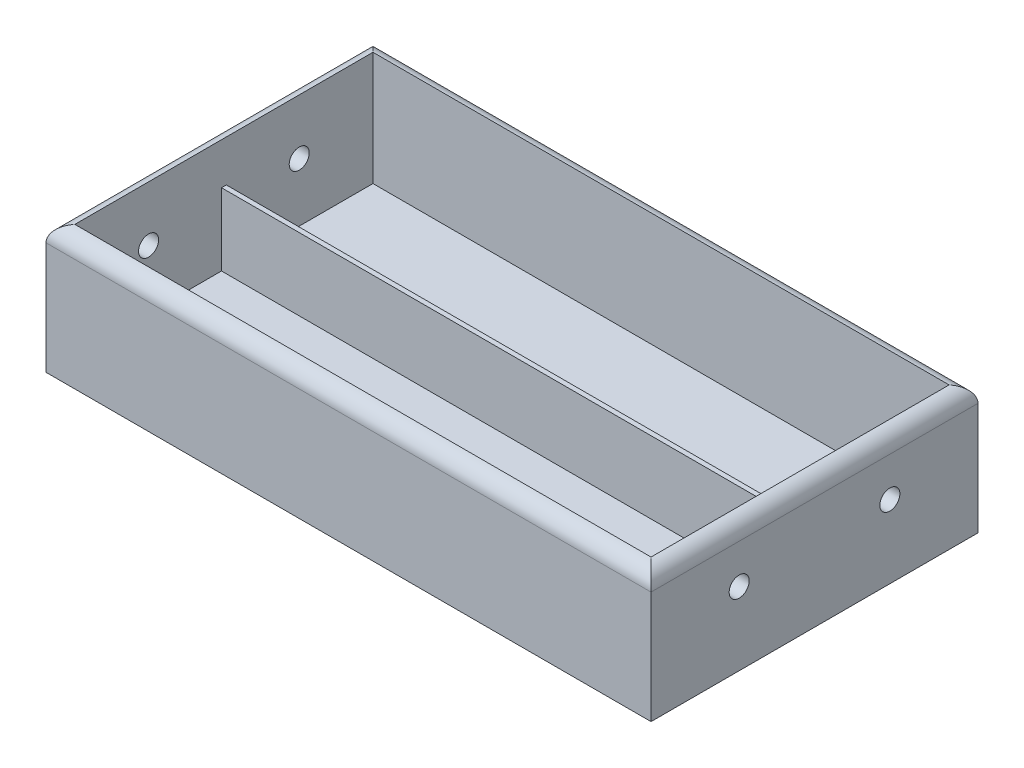
ISO-10303-21;
HEADER;
FILE_DESCRIPTION(('STEP AP214'),'2;1');
FILE_NAME('part.step','',(''),(''),'','','');
FILE_SCHEMA(('AUTOMOTIVE_DESIGN { 1 0 10303 214 1 1 1 1 }'));
ENDSEC;
DATA;
#1=APPLICATION_CONTEXT('core data for automotive mechanical design processes');
#2=APPLICATION_PROTOCOL_DEFINITION('international standard','automotive_design',2000,#1);
#3=PRODUCT_CONTEXT('',#1,'mechanical');
#4=PRODUCT('Part','Part','',(#3));
#5=PRODUCT_RELATED_PRODUCT_CATEGORY('part','',(#4));
#6=PRODUCT_DEFINITION_FORMATION('','',#4);
#7=PRODUCT_DEFINITION_CONTEXT('part definition',#1,'design');
#8=PRODUCT_DEFINITION('design','',#6,#7);
#9=PRODUCT_DEFINITION_SHAPE('','',#8);
#10=(LENGTH_UNIT() NAMED_UNIT(*) SI_UNIT(.MILLI.,.METRE.));
#11=(NAMED_UNIT(*) PLANE_ANGLE_UNIT() SI_UNIT($,.RADIAN.));
#12=(NAMED_UNIT(*) SI_UNIT($,.STERADIAN.) SOLID_ANGLE_UNIT());
#13=UNCERTAINTY_MEASURE_WITH_UNIT(LENGTH_MEASURE(1.E-05),#10,'distance_accuracy_value','');
#14=(GEOMETRIC_REPRESENTATION_CONTEXT(3) GLOBAL_UNCERTAINTY_ASSIGNED_CONTEXT((#13)) GLOBAL_UNIT_ASSIGNED_CONTEXT((#10,
#11,#12)) REPRESENTATION_CONTEXT('',''));
#15=CARTESIAN_POINT('',(0.,0.,0.));
#16=DIRECTION('',(0.,0.,1.));
#17=DIRECTION('',(1.,0.,0.));
#18=AXIS2_PLACEMENT_3D('',#15,#16,#17);
#19=CARTESIAN_POINT('',(0.,1.8,0.));
#20=DIRECTION('',(0.,1.,0.));
#21=DIRECTION('',(0.,0.,1.));
#22=AXIS2_PLACEMENT_3D('',#19,#20,#21);
#23=PLANE('',#22);
#24=DIRECTION('',(0.,0.,-1.));
#25=VECTOR('',#24,1.);
#26=CARTESIAN_POINT('',(35.95,1.8,-20.4));
#27=LINE('',#26,#25);
#28=CARTESIAN_POINT('',(35.95,1.8,18.6));
#29=VERTEX_POINT('',#28);
#30=CARTESIAN_POINT('',(35.95,1.8,0.3));
#31=VERTEX_POINT('',#30);
#32=EDGE_CURVE('E176',#29,#31,#27,.T.);
#33=ORIENTED_EDGE('',*,*,#32,.T.);
#34=DIRECTION('',(1.,0.,0.));
#35=VECTOR('',#34,1.);
#36=CARTESIAN_POINT('',(35.95,1.8,0.3));
#37=LINE('',#36,#35);
#38=CARTESIAN_POINT('',(-35.95,1.8,0.300000000000002));
#39=VERTEX_POINT('',#38);
#40=EDGE_CURVE('E154',#39,#31,#37,.T.);
#41=ORIENTED_EDGE('',*,*,#40,.F.);
#42=DIRECTION('',(0.,0.,1.));
#43=VECTOR('',#42,1.);
#44=CARTESIAN_POINT('',(-35.95,1.8,-20.4));
#45=LINE('',#44,#43);
#46=CARTESIAN_POINT('',(-35.95,1.8,18.6));
#47=VERTEX_POINT('',#46);
#48=EDGE_CURVE('E193',#39,#47,#45,.T.);
#49=ORIENTED_EDGE('',*,*,#48,.T.);
#50=DIRECTION('',(1.,0.,0.));
#51=VECTOR('',#50,1.);
#52=CARTESIAN_POINT('',(-37.75,1.8,18.6));
#53=LINE('',#52,#51);
#54=EDGE_CURVE('E189',#47,#29,#53,.T.);
#55=ORIENTED_EDGE('',*,*,#54,.T.);
#56=EDGE_LOOP('',(#33,#41,#49,#55));
#57=FACE_BOUND('',#56,.T.);
#58=ADVANCED_FACE('F45',(#57),#23,.T.);
#59=CARTESIAN_POINT('',(37.75,16.,-20.4));
#60=DIRECTION('',(-1.,0.,0.));
#61=DIRECTION('',(0.,0.,1.));
#62=AXIS2_PLACEMENT_3D('',#59,#60,#61);
#63=PLANE('',#62);
#64=CARTESIAN_POINT('',(37.75,9.1,-9.40000000000001));
#65=DIRECTION('',(-1.,0.,0.));
#66=DIRECTION('',(0.,0.,1.));
#67=AXIS2_PLACEMENT_3D('',#64,#65,#66);
#68=CIRCLE('',#67,1.25);
#69=CARTESIAN_POINT('',(37.75,9.1,-8.15000000000001));
#70=VERTEX_POINT('',#69);
#71=EDGE_CURVE('E243',#70,#70,#68,.F.);
#72=ORIENTED_EDGE('',*,*,#71,.F.);
#73=EDGE_LOOP('',(#72));
#74=FACE_BOUND('',#73,.T.);
#75=CARTESIAN_POINT('',(37.75,9.1,9.39999999999999));
#76=DIRECTION('',(-1.,0.,0.));
#77=DIRECTION('',(0.,0.,1.));
#78=AXIS2_PLACEMENT_3D('',#75,#76,#77);
#79=CIRCLE('',#78,1.25);
#80=CARTESIAN_POINT('',(37.75,9.1,10.65));
#81=VERTEX_POINT('',#80);
#82=EDGE_CURVE('E237',#81,#81,#79,.F.);
#83=ORIENTED_EDGE('',*,*,#82,.F.);
#84=EDGE_LOOP('',(#83));
#85=FACE_BOUND('',#84,.T.);
#86=DIRECTION('',(0.,-1.,0.));
#87=VECTOR('',#86,1.);
#88=CARTESIAN_POINT('',(37.75,16.,-20.4));
#89=LINE('',#88,#87);
#90=CARTESIAN_POINT('',(37.75,14.,-20.4));
#91=VERTEX_POINT('',#90);
#92=CARTESIAN_POINT('',(37.75,0.,-20.4));
#93=VERTEX_POINT('',#92);
#94=EDGE_CURVE('E229',#91,#93,#89,.T.);
#95=ORIENTED_EDGE('',*,*,#94,.F.);
#96=DIRECTION('',(0.,0.,-1.));
#97=VECTOR('',#96,1.);
#98=CARTESIAN_POINT('',(37.75,14.,20.4));
#99=LINE('',#98,#97);
#100=CARTESIAN_POINT('',(37.75,14.,20.4));
#101=VERTEX_POINT('',#100);
#102=EDGE_CURVE('E11',#91,#101,#99,.F.);
#103=ORIENTED_EDGE('',*,*,#102,.T.);
#104=DIRECTION('',(0.,-1.,0.));
#105=VECTOR('',#104,1.);
#106=CARTESIAN_POINT('',(37.75,16.,20.4));
#107=LINE('',#106,#105);
#108=CARTESIAN_POINT('',(37.75,0.,20.4));
#109=VERTEX_POINT('',#108);
#110=EDGE_CURVE('E220',#101,#109,#107,.T.);
#111=ORIENTED_EDGE('',*,*,#110,.T.);
#112=DIRECTION('',(0.,0.,-1.));
#113=VECTOR('',#112,1.);
#114=CARTESIAN_POINT('',(37.75,0.,-20.4));
#115=LINE('',#114,#113);
#116=EDGE_CURVE('E183',#109,#93,#115,.T.);
#117=ORIENTED_EDGE('',*,*,#116,.T.);
#118=EDGE_LOOP('',(#95,#103,#111,#117));
#119=FACE_BOUND('',#118,.T.);
#120=ADVANCED_FACE('F341',(#74,#85,#119),#63,.F.);
#121=CARTESIAN_POINT('',(-37.75,16.,-20.4));
#122=DIRECTION('',(0.,0.,1.));
#123=DIRECTION('',(1.,0.,0.));
#124=AXIS2_PLACEMENT_3D('',#121,#122,#123);
#125=PLANE('',#124);
#126=DIRECTION('',(0.,-1.,0.));
#127=VECTOR('',#126,1.);
#128=CARTESIAN_POINT('',(-37.75,16.,-20.4));
#129=LINE('',#128,#127);
#130=CARTESIAN_POINT('',(-37.75,14.,-20.4));
#131=VERTEX_POINT('',#130);
#132=CARTESIAN_POINT('',(-37.75,0.,-20.4));
#133=VERTEX_POINT('',#132);
#134=EDGE_CURVE('E226',#131,#133,#129,.T.);
#135=ORIENTED_EDGE('',*,*,#134,.F.);
#136=DIRECTION('',(-1.,0.,0.));
#137=VECTOR('',#136,1.);
#138=CARTESIAN_POINT('',(37.75,14.,-20.4));
#139=LINE('',#138,#137);
#140=EDGE_CURVE('E247',#131,#91,#139,.F.);
#141=ORIENTED_EDGE('',*,*,#140,.T.);
#142=ORIENTED_EDGE('',*,*,#94,.T.);
#143=DIRECTION('',(-1.,0.,0.));
#144=VECTOR('',#143,1.);
#145=CARTESIAN_POINT('',(-37.75,0.,-20.4));
#146=LINE('',#145,#144);
#147=EDGE_CURVE('E208',#93,#133,#146,.T.);
#148=ORIENTED_EDGE('',*,*,#147,.T.);
#149=EDGE_LOOP('',(#135,#141,#142,#148));
#150=FACE_BOUND('',#149,.T.);
#151=ADVANCED_FACE('F346',(#150),#125,.F.);
#152=CARTESIAN_POINT('',(-37.75,16.,-20.4));
#153=DIRECTION('',(1.,0.,0.));
#154=DIRECTION('',(0.,0.,-1.));
#155=AXIS2_PLACEMENT_3D('',#152,#153,#154);
#156=PLANE('',#155);
#157=CARTESIAN_POINT('',(-37.75,9.1,-9.39999999999999));
#158=DIRECTION('',(-1.,0.,0.));
#159=DIRECTION('',(0.,0.,1.));
#160=AXIS2_PLACEMENT_3D('',#157,#158,#159);
#161=CIRCLE('',#160,1.25);
#162=CARTESIAN_POINT('',(-37.75,9.1,-8.14999999999999));
#163=VERTEX_POINT('',#162);
#164=EDGE_CURVE('E278',#163,#163,#161,.T.);
#165=ORIENTED_EDGE('',*,*,#164,.F.);
#166=EDGE_LOOP('',(#165));
#167=FACE_BOUND('',#166,.T.);
#168=CARTESIAN_POINT('',(-37.75,9.1,9.40000000000001));
#169=DIRECTION('',(-1.,0.,0.));
#170=DIRECTION('',(0.,0.,1.));
#171=AXIS2_PLACEMENT_3D('',#168,#169,#170);
#172=CIRCLE('',#171,1.25);
#173=CARTESIAN_POINT('',(-37.75,9.1,10.65));
#174=VERTEX_POINT('',#173);
#175=EDGE_CURVE('E294',#174,#174,#172,.T.);
#176=ORIENTED_EDGE('',*,*,#175,.F.);
#177=EDGE_LOOP('',(#176));
#178=FACE_BOUND('',#177,.T.);
#179=DIRECTION('',(0.,-1.,0.));
#180=VECTOR('',#179,1.);
#181=CARTESIAN_POINT('',(-37.75,16.,20.4));
#182=LINE('',#181,#180);
#183=CARTESIAN_POINT('',(-37.75,14.,20.4));
#184=VERTEX_POINT('',#183);
#185=CARTESIAN_POINT('',(-37.75,0.,20.4));
#186=VERTEX_POINT('',#185);
#187=EDGE_CURVE('E223',#184,#186,#182,.T.);
#188=ORIENTED_EDGE('',*,*,#187,.F.);
#189=DIRECTION('',(0.,0.,1.));
#190=VECTOR('',#189,1.);
#191=CARTESIAN_POINT('',(-37.75,14.,-20.4));
#192=LINE('',#191,#190);
#193=EDGE_CURVE('E254',#184,#131,#192,.F.);
#194=ORIENTED_EDGE('',*,*,#193,.T.);
#195=ORIENTED_EDGE('',*,*,#134,.T.);
#196=DIRECTION('',(0.,0.,1.));
#197=VECTOR('',#196,1.);
#198=CARTESIAN_POINT('',(-37.75,0.,-20.4));
#199=LINE('',#198,#197);
#200=EDGE_CURVE('E212',#133,#186,#199,.T.);
#201=ORIENTED_EDGE('',*,*,#200,.T.);
#202=EDGE_LOOP('',(#188,#194,#195,#201));
#203=FACE_BOUND('',#202,.T.);
#204=ADVANCED_FACE('F395',(#167,#178,#203),#156,.F.);
#205=CARTESIAN_POINT('',(-37.75,16.,20.4));
#206=DIRECTION('',(0.,0.,-1.));
#207=DIRECTION('',(-1.,0.,0.));
#208=AXIS2_PLACEMENT_3D('',#205,#206,#207);
#209=PLANE('',#208);
#210=ORIENTED_EDGE('',*,*,#110,.F.);
#211=DIRECTION('',(1.,0.,0.));
#212=VECTOR('',#211,1.);
#213=CARTESIAN_POINT('',(-37.75,14.,20.4));
#214=LINE('',#213,#212);
#215=EDGE_CURVE('E259',#101,#184,#214,.F.);
#216=ORIENTED_EDGE('',*,*,#215,.T.);
#217=ORIENTED_EDGE('',*,*,#187,.T.);
#218=DIRECTION('',(1.,0.,0.));
#219=VECTOR('',#218,1.);
#220=CARTESIAN_POINT('',(-37.75,0.,20.4));
#221=LINE('',#220,#219);
#222=EDGE_CURVE('E216',#186,#109,#221,.T.);
#223=ORIENTED_EDGE('',*,*,#222,.T.);
#224=EDGE_LOOP('',(#210,#216,#217,#223));
#225=FACE_BOUND('',#224,.T.);
#226=ADVANCED_FACE('F398',(#225),#209,.F.);
#227=CARTESIAN_POINT('',(0.,0.,0.));
#228=DIRECTION('',(0.,1.,0.));
#229=DIRECTION('',(0.,0.,1.));
#230=AXIS2_PLACEMENT_3D('',#227,#228,#229);
#231=PLANE('',#230);
#232=ORIENTED_EDGE('',*,*,#116,.F.);
#233=ORIENTED_EDGE('',*,*,#222,.F.);
#234=ORIENTED_EDGE('',*,*,#200,.F.);
#235=ORIENTED_EDGE('',*,*,#147,.F.);
#236=EDGE_LOOP('',(#232,#233,#234,#235));
#237=FACE_BOUND('',#236,.T.);
#238=ADVANCED_FACE('F367',(#237),#231,.F.);
#239=CARTESIAN_POINT('',(35.95,16.,-20.4));
#240=DIRECTION('',(-1.,0.,0.));
#241=DIRECTION('',(0.,0.,1.));
#242=AXIS2_PLACEMENT_3D('',#239,#240,#241);
#243=PLANE('',#242);
#244=CARTESIAN_POINT('',(35.95,9.1,-9.40000000000001));
#245=DIRECTION('',(-1.,0.,0.));
#246=DIRECTION('',(0.,0.,1.));
#247=AXIS2_PLACEMENT_3D('',#244,#245,#246);
#248=CIRCLE('',#247,1.25);
#249=CARTESIAN_POINT('',(35.95,9.1,-8.15000000000001));
#250=VERTEX_POINT('',#249);
#251=EDGE_CURVE('E242',#250,#250,#248,.T.);
#252=ORIENTED_EDGE('',*,*,#251,.F.);
#253=EDGE_LOOP('',(#252));
#254=FACE_BOUND('',#253,.T.);
#255=CARTESIAN_POINT('',(35.95,9.1,9.4));
#256=DIRECTION('',(-1.,0.,0.));
#257=DIRECTION('',(0.,0.,1.));
#258=AXIS2_PLACEMENT_3D('',#255,#256,#257);
#259=CIRCLE('',#258,1.25);
#260=CARTESIAN_POINT('',(35.95,9.1,10.65));
#261=VERTEX_POINT('',#260);
#262=EDGE_CURVE('E159',#261,#261,#259,.T.);
#263=ORIENTED_EDGE('',*,*,#262,.F.);
#264=EDGE_LOOP('',(#263));
#265=FACE_BOUND('',#264,.T.);
#266=DIRECTION('',(0.,-1.,0.));
#267=VECTOR('',#266,1.);
#268=CARTESIAN_POINT('',(35.95,16.,18.6));
#269=LINE('',#268,#267);
#270=CARTESIAN_POINT('',(35.95,15.9899748742132,18.6));
#271=VERTEX_POINT('',#270);
#272=EDGE_CURVE('E185',#271,#29,#269,.T.);
#273=ORIENTED_EDGE('',*,*,#272,.F.);
#274=DIRECTION('',(0.,0.,1.));
#275=VECTOR('',#274,1.);
#276=CARTESIAN_POINT('',(35.95,15.9899748742132,0.));
#277=LINE('',#276,#275);
#278=CARTESIAN_POINT('',(35.95,15.9899748742132,-18.6));
#279=VERTEX_POINT('',#278);
#280=EDGE_CURVE('E55',#271,#279,#277,.F.);
#281=ORIENTED_EDGE('',*,*,#280,.T.);
#282=DIRECTION('',(0.,-1.,0.));
#283=VECTOR('',#282,1.);
#284=CARTESIAN_POINT('',(35.95,16.,-18.6));
#285=LINE('',#284,#283);
#286=CARTESIAN_POINT('',(35.95,1.8,-18.6));
#287=VERTEX_POINT('',#286);
#288=EDGE_CURVE('E180',#279,#287,#285,.T.);
#289=ORIENTED_EDGE('',*,*,#288,.T.);
#290=CARTESIAN_POINT('',(35.95,1.8,-0.3));
#291=VERTEX_POINT('',#290);
#292=EDGE_CURVE('E170',#291,#287,#27,.T.);
#293=ORIENTED_EDGE('',*,*,#292,.F.);
#294=DIRECTION('',(0.,1.,0.));
#295=VECTOR('',#294,1.);
#296=CARTESIAN_POINT('',(35.95,10.8,-0.3));
#297=LINE('',#296,#295);
#298=CARTESIAN_POINT('',(35.95,10.8,-0.3));
#299=VERTEX_POINT('',#298);
#300=EDGE_CURVE('E164',#291,#299,#297,.T.);
#301=ORIENTED_EDGE('',*,*,#300,.T.);
#302=DIRECTION('',(0.,0.,1.));
#303=VECTOR('',#302,1.);
#304=CARTESIAN_POINT('',(35.95,10.8,-0.3));
#305=LINE('',#304,#303);
#306=CARTESIAN_POINT('',(35.95,10.8,0.3));
#307=VERTEX_POINT('',#306);
#308=EDGE_CURVE('E141',#299,#307,#305,.T.);
#309=ORIENTED_EDGE('',*,*,#308,.T.);
#310=DIRECTION('',(0.,1.,0.));
#311=VECTOR('',#310,1.);
#312=CARTESIAN_POINT('',(35.95,10.8,0.3));
#313=LINE('',#312,#311);
#314=EDGE_CURVE('E149',#31,#307,#313,.T.);
#315=ORIENTED_EDGE('',*,*,#314,.F.);
#316=ORIENTED_EDGE('',*,*,#32,.F.);
#317=EDGE_LOOP('',(#273,#281,#289,#293,#301,#309,#315,#316));
#318=FACE_BOUND('',#317,.T.);
#319=ADVANCED_FACE('F162',(#254,#265,#318),#243,.T.);
#320=CARTESIAN_POINT('',(-37.75,16.,-18.6));
#321=DIRECTION('',(0.,0.,1.));
#322=DIRECTION('',(1.,0.,0.));
#323=AXIS2_PLACEMENT_3D('',#320,#321,#322);
#324=PLANE('',#323);
#325=ORIENTED_EDGE('',*,*,#288,.F.);
#326=DIRECTION('',(1.,0.,0.));
#327=VECTOR('',#326,1.);
#328=CARTESIAN_POINT('',(0.,15.9899748742132,-18.6));
#329=LINE('',#328,#327);
#330=CARTESIAN_POINT('',(-35.95,15.9899748742132,-18.6));
#331=VERTEX_POINT('',#330);
#332=EDGE_CURVE('E232',#279,#331,#329,.F.);
#333=ORIENTED_EDGE('',*,*,#332,.T.);
#334=DIRECTION('',(0.,-1.,0.));
#335=VECTOR('',#334,1.);
#336=CARTESIAN_POINT('',(-35.95,16.,-18.6));
#337=LINE('',#336,#335);
#338=CARTESIAN_POINT('',(-35.95,1.8,-18.6));
#339=VERTEX_POINT('',#338);
#340=EDGE_CURVE('E184',#331,#339,#337,.T.);
#341=ORIENTED_EDGE('',*,*,#340,.T.);
#342=DIRECTION('',(-1.,0.,0.));
#343=VECTOR('',#342,1.);
#344=CARTESIAN_POINT('',(-37.75,1.8,-18.6));
#345=LINE('',#344,#343);
#346=EDGE_CURVE('E179',#287,#339,#345,.T.);
#347=ORIENTED_EDGE('',*,*,#346,.F.);
#348=EDGE_LOOP('',(#325,#333,#341,#347));
#349=FACE_BOUND('',#348,.T.);
#350=ADVANCED_FACE('F326',(#349),#324,.T.);
#351=CARTESIAN_POINT('',(-35.95,16.,-20.4));
#352=DIRECTION('',(1.,0.,0.));
#353=DIRECTION('',(0.,0.,-1.));
#354=AXIS2_PLACEMENT_3D('',#351,#352,#353);
#355=PLANE('',#354);
#356=CARTESIAN_POINT('',(-35.95,9.1,-9.39999999999999));
#357=DIRECTION('',(1.,0.,0.));
#358=DIRECTION('',(0.,0.,-1.));
#359=AXIS2_PLACEMENT_3D('',#356,#357,#358);
#360=CIRCLE('',#359,1.25);
#361=CARTESIAN_POINT('',(-35.95,9.1,-10.65));
#362=VERTEX_POINT('',#361);
#363=EDGE_CURVE('E238',#362,#362,#360,.T.);
#364=ORIENTED_EDGE('',*,*,#363,.F.);
#365=EDGE_LOOP('',(#364));
#366=FACE_BOUND('',#365,.T.);
#367=CARTESIAN_POINT('',(-35.95,9.1,9.40000000000001));
#368=DIRECTION('',(1.,0.,0.));
#369=DIRECTION('',(0.,0.,-1.));
#370=AXIS2_PLACEMENT_3D('',#367,#368,#369);
#371=CIRCLE('',#370,1.25);
#372=CARTESIAN_POINT('',(-35.95,9.1,8.15000000000001));
#373=VERTEX_POINT('',#372);
#374=EDGE_CURVE('E233',#373,#373,#371,.T.);
#375=ORIENTED_EDGE('',*,*,#374,.F.);
#376=EDGE_LOOP('',(#375));
#377=FACE_BOUND('',#376,.T.);
#378=ORIENTED_EDGE('',*,*,#340,.F.);
#379=DIRECTION('',(0.,0.,-1.));
#380=VECTOR('',#379,1.);
#381=CARTESIAN_POINT('',(-35.95,15.9899748742132,0.));
#382=LINE('',#381,#380);
#383=CARTESIAN_POINT('',(-35.95,15.9899748742132,18.6));
#384=VERTEX_POINT('',#383);
#385=EDGE_CURVE('E251',#331,#384,#382,.F.);
#386=ORIENTED_EDGE('',*,*,#385,.T.);
#387=DIRECTION('',(0.,-1.,0.));
#388=VECTOR('',#387,1.);
#389=CARTESIAN_POINT('',(-35.95,16.,18.6));
#390=LINE('',#389,#388);
#391=EDGE_CURVE('E188',#384,#47,#390,.T.);
#392=ORIENTED_EDGE('',*,*,#391,.T.);
#393=ORIENTED_EDGE('',*,*,#48,.F.);
#394=DIRECTION('',(0.,-1.,0.));
#395=VECTOR('',#394,1.);
#396=CARTESIAN_POINT('',(-35.95,1.8,0.3));
#397=LINE('',#396,#395);
#398=CARTESIAN_POINT('',(-35.95,10.8,0.3));
#399=VERTEX_POINT('',#398);
#400=EDGE_CURVE('E148',#399,#39,#397,.T.);
#401=ORIENTED_EDGE('',*,*,#400,.F.);
#402=DIRECTION('',(0.,0.,1.));
#403=VECTOR('',#402,1.);
#404=CARTESIAN_POINT('',(-35.95,10.8,-0.3));
#405=LINE('',#404,#403);
#406=CARTESIAN_POINT('',(-35.95,10.8,-0.3));
#407=VERTEX_POINT('',#406);
#408=EDGE_CURVE('E144',#407,#399,#405,.T.);
#409=ORIENTED_EDGE('',*,*,#408,.F.);
#410=DIRECTION('',(0.,-1.,0.));
#411=VECTOR('',#410,1.);
#412=CARTESIAN_POINT('',(-35.95,1.8,-0.3));
#413=LINE('',#412,#411);
#414=CARTESIAN_POINT('',(-35.95,1.8,-0.3));
#415=VERTEX_POINT('',#414);
#416=EDGE_CURVE('E173',#407,#415,#413,.T.);
#417=ORIENTED_EDGE('',*,*,#416,.T.);
#418=EDGE_CURVE('E196',#339,#415,#45,.T.);
#419=ORIENTED_EDGE('',*,*,#418,.F.);
#420=EDGE_LOOP('',(#378,#386,#392,#393,#401,#409,#417,#419));
#421=FACE_BOUND('',#420,.T.);
#422=ADVANCED_FACE('F318',(#366,#377,#421),#355,.T.);
#423=CARTESIAN_POINT('',(-37.75,16.,18.6));
#424=DIRECTION('',(0.,0.,-1.));
#425=DIRECTION('',(-1.,0.,0.));
#426=AXIS2_PLACEMENT_3D('',#423,#424,#425);
#427=PLANE('',#426);
#428=ORIENTED_EDGE('',*,*,#391,.F.);
#429=DIRECTION('',(-1.,0.,0.));
#430=VECTOR('',#429,1.);
#431=CARTESIAN_POINT('',(0.,15.9899748742132,18.6));
#432=LINE('',#431,#430);
#433=EDGE_CURVE('E69',#384,#271,#432,.F.);
#434=ORIENTED_EDGE('',*,*,#433,.T.);
#435=ORIENTED_EDGE('',*,*,#272,.T.);
#436=ORIENTED_EDGE('',*,*,#54,.F.);
#437=EDGE_LOOP('',(#428,#434,#435,#436));
#438=FACE_BOUND('',#437,.T.);
#439=ADVANCED_FACE('F333',(#438),#427,.T.);
#440=DIRECTION('',(1.,0.,0.));
#441=VECTOR('',#440,1.);
#442=CARTESIAN_POINT('',(35.95,1.8,-0.3));
#443=LINE('',#442,#441);
#444=EDGE_CURVE('E166',#415,#291,#443,.T.);
#445=ORIENTED_EDGE('',*,*,#444,.T.);
#446=ORIENTED_EDGE('',*,*,#292,.T.);
#447=ORIENTED_EDGE('',*,*,#346,.T.);
#448=ORIENTED_EDGE('',*,*,#418,.T.);
#449=EDGE_LOOP('',(#445,#446,#447,#448));
#450=FACE_BOUND('',#449,.T.);
#451=ADVANCED_FACE('F321',(#450),#23,.T.);
#452=CARTESIAN_POINT('',(-35.95,10.8,-0.3));
#453=DIRECTION('',(0.,1.,0.));
#454=DIRECTION('',(0.,0.,1.));
#455=AXIS2_PLACEMENT_3D('',#452,#453,#454);
#456=PLANE('',#455);
#457=ORIENTED_EDGE('',*,*,#408,.T.);
#458=DIRECTION('',(-1.,0.,0.));
#459=VECTOR('',#458,1.);
#460=CARTESIAN_POINT('',(-35.95,10.8,0.3));
#461=LINE('',#460,#459);
#462=EDGE_CURVE('E136',#307,#399,#461,.T.);
#463=ORIENTED_EDGE('',*,*,#462,.F.);
#464=ORIENTED_EDGE('',*,*,#308,.F.);
#465=DIRECTION('',(-1.,0.,0.));
#466=VECTOR('',#465,1.);
#467=CARTESIAN_POINT('',(-35.95,10.8,-0.3));
#468=LINE('',#467,#466);
#469=EDGE_CURVE('E310',#299,#407,#468,.T.);
#470=ORIENTED_EDGE('',*,*,#469,.T.);
#471=EDGE_LOOP('',(#457,#463,#464,#470));
#472=FACE_BOUND('',#471,.T.);
#473=ADVANCED_FACE('F138',(#472),#456,.T.);
#474=CARTESIAN_POINT('',(0.,0.,-0.3));
#475=DIRECTION('',(0.,0.,-1.));
#476=DIRECTION('',(-1.,0.,0.));
#477=AXIS2_PLACEMENT_3D('',#474,#475,#476);
#478=PLANE('',#477);
#479=ORIENTED_EDGE('',*,*,#300,.F.);
#480=ORIENTED_EDGE('',*,*,#444,.F.);
#481=ORIENTED_EDGE('',*,*,#416,.F.);
#482=ORIENTED_EDGE('',*,*,#469,.F.);
#483=EDGE_LOOP('',(#479,#480,#481,#482));
#484=FACE_BOUND('',#483,.T.);
#485=ADVANCED_FACE('F356',(#484),#478,.T.);
#486=CARTESIAN_POINT('',(0.,0.,0.3));
#487=DIRECTION('',(0.,0.,-1.));
#488=DIRECTION('',(-1.,0.,0.));
#489=AXIS2_PLACEMENT_3D('',#486,#487,#488);
#490=PLANE('',#489);
#491=ORIENTED_EDGE('',*,*,#314,.T.);
#492=ORIENTED_EDGE('',*,*,#462,.T.);
#493=ORIENTED_EDGE('',*,*,#400,.T.);
#494=ORIENTED_EDGE('',*,*,#40,.T.);
#495=EDGE_LOOP('',(#491,#492,#493,#494));
#496=FACE_BOUND('',#495,.T.);
#497=ADVANCED_FACE('F152',(#496),#490,.F.);
#498=CARTESIAN_POINT('',(41.2855339059327,9.1,9.39999999999999));
#499=DIRECTION('',(-1.,0.,0.));
#500=DIRECTION('',(0.,0.,1.));
#501=AXIS2_PLACEMENT_3D('',#498,#499,#500);
#502=CYLINDRICAL_SURFACE('',#501,1.25);
#503=ORIENTED_EDGE('',*,*,#374,.T.);
#504=EDGE_LOOP('',(#503));
#505=FACE_BOUND('',#504,.T.);
#506=ORIENTED_EDGE('',*,*,#175,.T.);
#507=EDGE_LOOP('',(#506));
#508=FACE_BOUND('',#507,.T.);
#509=ADVANCED_FACE('F374',(#505,#508),#502,.F.);
#510=ORIENTED_EDGE('',*,*,#262,.T.);
#511=EDGE_LOOP('',(#510));
#512=FACE_BOUND('',#511,.T.);
#513=ORIENTED_EDGE('',*,*,#82,.T.);
#514=EDGE_LOOP('',(#513));
#515=FACE_BOUND('',#514,.T.);
#516=ADVANCED_FACE('F377',(#512,#515),#502,.F.);
#517=CARTESIAN_POINT('',(41.2855339059327,9.1,-9.40000000000001));
#518=DIRECTION('',(-1.,0.,0.));
#519=DIRECTION('',(0.,0.,1.));
#520=AXIS2_PLACEMENT_3D('',#517,#518,#519);
#521=CYLINDRICAL_SURFACE('',#520,1.25);
#522=ORIENTED_EDGE('',*,*,#363,.T.);
#523=EDGE_LOOP('',(#522));
#524=FACE_BOUND('',#523,.T.);
#525=ORIENTED_EDGE('',*,*,#164,.T.);
#526=EDGE_LOOP('',(#525));
#527=FACE_BOUND('',#526,.T.);
#528=ADVANCED_FACE('F379',(#524,#527),#521,.F.);
#529=ORIENTED_EDGE('',*,*,#251,.T.);
#530=EDGE_LOOP('',(#529));
#531=FACE_BOUND('',#530,.T.);
#532=ORIENTED_EDGE('',*,*,#71,.T.);
#533=EDGE_LOOP('',(#532));
#534=FACE_BOUND('',#533,.T.);
#535=ADVANCED_FACE('F381',(#531,#534),#521,.F.);
#536=CARTESIAN_POINT('',(0.,14.,18.4));
#537=DIRECTION('',(-1.,0.,0.));
#538=DIRECTION('',(0.,0.,1.));
#539=AXIS2_PLACEMENT_3D('',#536,#537,#538);
#540=CYLINDRICAL_SURFACE('',#539,2.);
#541=CARTESIAN_POINT('',(-35.75,14.,18.4));
#542=DIRECTION('',(-0.707106781186548,0.,-0.707106781186547));
#543=DIRECTION('',(-0.707106781186547,0.,0.707106781186548));
#544=AXIS2_PLACEMENT_3D('',#541,#542,#543);
#545=ELLIPSE('',#544,2.82842712474619,2.);
#546=EDGE_CURVE('E269',#184,#384,#545,.T.);
#547=ORIENTED_EDGE('',*,*,#546,.F.);
#548=ORIENTED_EDGE('',*,*,#215,.F.);
#549=CARTESIAN_POINT('',(35.75,14.,18.4));
#550=DIRECTION('',(-0.707106781186547,0.,0.707106781186547));
#551=DIRECTION('',(0.707106781186547,0.,0.707106781186547));
#552=AXIS2_PLACEMENT_3D('',#549,#550,#551);
#553=ELLIPSE('',#552,2.82842712474619,2.);
#554=EDGE_CURVE('E49',#271,#101,#553,.F.);
#555=ORIENTED_EDGE('',*,*,#554,.F.);
#556=ORIENTED_EDGE('',*,*,#433,.F.);
#557=EDGE_LOOP('',(#547,#548,#555,#556));
#558=FACE_BOUND('',#557,.T.);
#559=ADVANCED_FACE('F47',(#558),#540,.T.);
#560=CARTESIAN_POINT('',(35.75,14.,0.));
#561=DIRECTION('',(0.,0.,1.));
#562=DIRECTION('',(1.,0.,0.));
#563=AXIS2_PLACEMENT_3D('',#560,#561,#562);
#564=CYLINDRICAL_SURFACE('',#563,2.);
#565=ORIENTED_EDGE('',*,*,#554,.T.);
#566=ORIENTED_EDGE('',*,*,#102,.F.);
#567=CARTESIAN_POINT('',(35.75,14.,-18.4));
#568=DIRECTION('',(0.707106781186547,0.,0.707106781186547));
#569=DIRECTION('',(-0.707106781186547,0.,0.707106781186547));
#570=AXIS2_PLACEMENT_3D('',#567,#568,#569);
#571=ELLIPSE('',#570,2.82842712474619,2.);
#572=EDGE_CURVE('E267',#279,#91,#571,.F.);
#573=ORIENTED_EDGE('',*,*,#572,.F.);
#574=ORIENTED_EDGE('',*,*,#280,.F.);
#575=EDGE_LOOP('',(#565,#566,#573,#574));
#576=FACE_BOUND('',#575,.T.);
#577=ADVANCED_FACE('F336',(#576),#564,.T.);
#578=CARTESIAN_POINT('',(-35.75,14.,0.));
#579=DIRECTION('',(0.,0.,-1.));
#580=DIRECTION('',(-1.,0.,0.));
#581=AXIS2_PLACEMENT_3D('',#578,#579,#580);
#582=CYLINDRICAL_SURFACE('',#581,2.);
#583=ORIENTED_EDGE('',*,*,#546,.T.);
#584=ORIENTED_EDGE('',*,*,#385,.F.);
#585=CARTESIAN_POINT('',(-35.75,14.,-18.4));
#586=DIRECTION('',(0.707106781186547,0.,-0.707106781186548));
#587=DIRECTION('',(-0.707106781186548,0.,-0.707106781186547));
#588=AXIS2_PLACEMENT_3D('',#585,#586,#587);
#589=ELLIPSE('',#588,2.82842712474619,2.);
#590=EDGE_CURVE('E264',#131,#331,#589,.T.);
#591=ORIENTED_EDGE('',*,*,#590,.F.);
#592=ORIENTED_EDGE('',*,*,#193,.F.);
#593=EDGE_LOOP('',(#583,#584,#591,#592));
#594=FACE_BOUND('',#593,.T.);
#595=ADVANCED_FACE('F413',(#594),#582,.T.);
#596=CARTESIAN_POINT('',(0.,14.,-18.4));
#597=DIRECTION('',(1.,0.,0.));
#598=DIRECTION('',(0.,0.,-1.));
#599=AXIS2_PLACEMENT_3D('',#596,#597,#598);
#600=CYLINDRICAL_SURFACE('',#599,2.);
#601=ORIENTED_EDGE('',*,*,#572,.T.);
#602=ORIENTED_EDGE('',*,*,#140,.F.);
#603=ORIENTED_EDGE('',*,*,#590,.T.);
#604=ORIENTED_EDGE('',*,*,#332,.F.);
#605=EDGE_LOOP('',(#601,#602,#603,#604));
#606=FACE_BOUND('',#605,.T.);
#607=ADVANCED_FACE('F412',(#606),#600,.T.);
#608=CLOSED_SHELL('',(#58,#120,#151,#204,#226,#238,#319,#350,#422,#439,#451,#473,#485,#497,#509,
#516,#528,#535,#559,#577,#595,#607));
#609=MANIFOLD_SOLID_BREP('B2',#608);
#610=ADVANCED_BREP_SHAPE_REPRESENTATION('',(#18,#609),#14);
#611=SHAPE_DEFINITION_REPRESENTATION(#9,#610);
ENDSEC;
END-ISO-10303-21;
